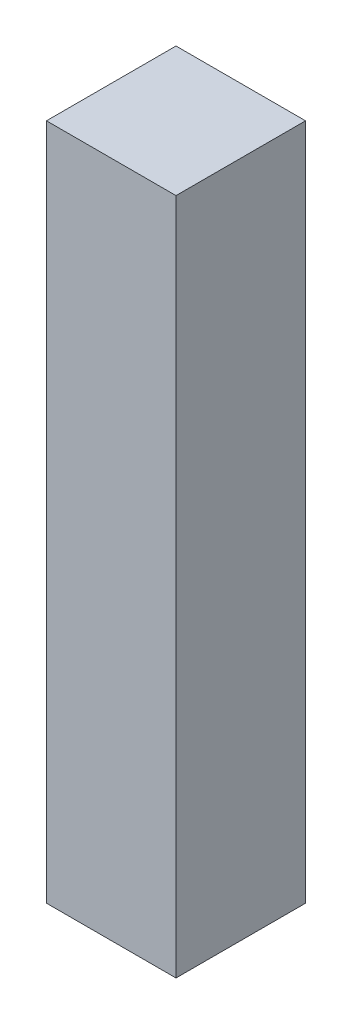
ISO-10303-21;
HEADER;
FILE_DESCRIPTION(('STEP AP214'),'2;1');
FILE_NAME('part.step','',(''),(''),'','','');
FILE_SCHEMA(('AUTOMOTIVE_DESIGN { 1 0 10303 214 1 1 1 1 }'));
ENDSEC;
DATA;
#1=APPLICATION_CONTEXT('core data for automotive mechanical design processes');
#2=APPLICATION_PROTOCOL_DEFINITION('international standard','automotive_design',2000,#1);
#3=PRODUCT_CONTEXT('',#1,'mechanical');
#4=PRODUCT('Part','Part','',(#3));
#5=PRODUCT_RELATED_PRODUCT_CATEGORY('part','',(#4));
#6=PRODUCT_DEFINITION_FORMATION('','',#4);
#7=PRODUCT_DEFINITION_CONTEXT('part definition',#1,'design');
#8=PRODUCT_DEFINITION('design','',#6,#7);
#9=PRODUCT_DEFINITION_SHAPE('','',#8);
#10=(LENGTH_UNIT() NAMED_UNIT(*) SI_UNIT(.MILLI.,.METRE.));
#11=(NAMED_UNIT(*) PLANE_ANGLE_UNIT() SI_UNIT($,.RADIAN.));
#12=(NAMED_UNIT(*) SI_UNIT($,.STERADIAN.) SOLID_ANGLE_UNIT());
#13=UNCERTAINTY_MEASURE_WITH_UNIT(LENGTH_MEASURE(1.E-05),#10,'distance_accuracy_value','');
#14=(GEOMETRIC_REPRESENTATION_CONTEXT(3) GLOBAL_UNCERTAINTY_ASSIGNED_CONTEXT((#13)) GLOBAL_UNIT_ASSIGNED_CONTEXT((#10,
#11,#12)) REPRESENTATION_CONTEXT('',''));
#15=CARTESIAN_POINT('',(0.,0.,0.));
#16=DIRECTION('',(0.,0.,1.));
#17=DIRECTION('',(1.,0.,0.));
#18=AXIS2_PLACEMENT_3D('',#15,#16,#17);
#19=CARTESIAN_POINT('',(41.275,431.8,-41.275));
#20=DIRECTION('',(-1.,0.,0.));
#21=DIRECTION('',(0.,0.,1.));
#22=AXIS2_PLACEMENT_3D('',#19,#20,#21);
#23=PLANE('',#22);
#24=DIRECTION('',(0.,0.,-1.));
#25=VECTOR('',#24,1.);
#26=CARTESIAN_POINT('',(41.275,0.,-41.275));
#27=LINE('',#26,#25);
#28=CARTESIAN_POINT('',(41.275,0.,41.275));
#29=VERTEX_POINT('',#28);
#30=CARTESIAN_POINT('',(41.275,0.,-41.275));
#31=VERTEX_POINT('',#30);
#32=EDGE_CURVE('E96',#29,#31,#27,.T.);
#33=ORIENTED_EDGE('',*,*,#32,.T.);
#34=DIRECTION('',(0.,-1.,0.));
#35=VECTOR('',#34,1.);
#36=CARTESIAN_POINT('',(41.275,431.8,-41.275));
#37=LINE('',#36,#35);
#38=CARTESIAN_POINT('',(41.275,431.8,-41.275));
#39=VERTEX_POINT('',#38);
#40=EDGE_CURVE('E11',#39,#31,#37,.T.);
#41=ORIENTED_EDGE('',*,*,#40,.F.);
#42=DIRECTION('',(0.,0.,-1.));
#43=VECTOR('',#42,1.);
#44=CARTESIAN_POINT('',(41.275,431.8,-41.275));
#45=LINE('',#44,#43);
#46=CARTESIAN_POINT('',(41.275,431.8,41.275));
#47=VERTEX_POINT('',#46);
#48=EDGE_CURVE('E84',#47,#39,#45,.T.);
#49=ORIENTED_EDGE('',*,*,#48,.F.);
#50=DIRECTION('',(0.,-1.,0.));
#51=VECTOR('',#50,1.);
#52=CARTESIAN_POINT('',(41.275,431.8,41.275));
#53=LINE('',#52,#51);
#54=EDGE_CURVE('E92',#47,#29,#53,.T.);
#55=ORIENTED_EDGE('',*,*,#54,.T.);
#56=EDGE_LOOP('',(#33,#41,#49,#55));
#57=FACE_BOUND('',#56,.T.);
#58=ADVANCED_FACE('F33',(#57),#23,.F.);
#59=CARTESIAN_POINT('',(-41.275,431.8,-41.275));
#60=DIRECTION('',(0.,0.,1.));
#61=DIRECTION('',(1.,0.,0.));
#62=AXIS2_PLACEMENT_3D('',#59,#60,#61);
#63=PLANE('',#62);
#64=DIRECTION('',(-1.,0.,0.));
#65=VECTOR('',#64,1.);
#66=CARTESIAN_POINT('',(-41.275,0.,-41.275));
#67=LINE('',#66,#65);
#68=CARTESIAN_POINT('',(-41.275,0.,-41.275));
#69=VERTEX_POINT('',#68);
#70=EDGE_CURVE('E88',#31,#69,#67,.T.);
#71=ORIENTED_EDGE('',*,*,#70,.T.);
#72=DIRECTION('',(0.,-1.,0.));
#73=VECTOR('',#72,1.);
#74=CARTESIAN_POINT('',(-41.275,431.8,-41.275));
#75=LINE('',#74,#73);
#76=CARTESIAN_POINT('',(-41.275,431.8,-41.275));
#77=VERTEX_POINT('',#76);
#78=EDGE_CURVE('E41',#77,#69,#75,.T.);
#79=ORIENTED_EDGE('',*,*,#78,.F.);
#80=DIRECTION('',(-1.,0.,0.));
#81=VECTOR('',#80,1.);
#82=CARTESIAN_POINT('',(-41.275,431.8,-41.275));
#83=LINE('',#82,#81);
#84=EDGE_CURVE('E79',#39,#77,#83,.T.);
#85=ORIENTED_EDGE('',*,*,#84,.F.);
#86=ORIENTED_EDGE('',*,*,#40,.T.);
#87=EDGE_LOOP('',(#71,#79,#85,#86));
#88=FACE_BOUND('',#87,.T.);
#89=ADVANCED_FACE('F87',(#88),#63,.F.);
#90=CARTESIAN_POINT('',(-41.275,431.8,-41.275));
#91=DIRECTION('',(1.,0.,0.));
#92=DIRECTION('',(0.,0.,-1.));
#93=AXIS2_PLACEMENT_3D('',#90,#91,#92);
#94=PLANE('',#93);
#95=DIRECTION('',(0.,0.,1.));
#96=VECTOR('',#95,1.);
#97=CARTESIAN_POINT('',(-41.275,0.,-41.275));
#98=LINE('',#97,#96);
#99=CARTESIAN_POINT('',(-41.275,0.,41.275));
#100=VERTEX_POINT('',#99);
#101=EDGE_CURVE('E66',#69,#100,#98,.T.);
#102=ORIENTED_EDGE('',*,*,#101,.T.);
#103=DIRECTION('',(0.,-1.,0.));
#104=VECTOR('',#103,1.);
#105=CARTESIAN_POINT('',(-41.275,431.8,41.275));
#106=LINE('',#105,#104);
#107=CARTESIAN_POINT('',(-41.275,431.8,41.275));
#108=VERTEX_POINT('',#107);
#109=EDGE_CURVE('E89',#108,#100,#106,.T.);
#110=ORIENTED_EDGE('',*,*,#109,.F.);
#111=DIRECTION('',(0.,0.,1.));
#112=VECTOR('',#111,1.);
#113=CARTESIAN_POINT('',(-41.275,431.8,-41.275));
#114=LINE('',#113,#112);
#115=EDGE_CURVE('E82',#77,#108,#114,.T.);
#116=ORIENTED_EDGE('',*,*,#115,.F.);
#117=ORIENTED_EDGE('',*,*,#78,.T.);
#118=EDGE_LOOP('',(#102,#110,#116,#117));
#119=FACE_BOUND('',#118,.T.);
#120=ADVANCED_FACE('F90',(#119),#94,.F.);
#121=CARTESIAN_POINT('',(-41.275,431.8,41.275));
#122=DIRECTION('',(0.,0.,-1.));
#123=DIRECTION('',(-1.,0.,0.));
#124=AXIS2_PLACEMENT_3D('',#121,#122,#123);
#125=PLANE('',#124);
#126=DIRECTION('',(1.,0.,0.));
#127=VECTOR('',#126,1.);
#128=CARTESIAN_POINT('',(-41.275,0.,41.275));
#129=LINE('',#128,#127);
#130=EDGE_CURVE('E72',#100,#29,#129,.T.);
#131=ORIENTED_EDGE('',*,*,#130,.T.);
#132=ORIENTED_EDGE('',*,*,#54,.F.);
#133=DIRECTION('',(1.,0.,0.));
#134=VECTOR('',#133,1.);
#135=CARTESIAN_POINT('',(-41.275,431.8,41.275));
#136=LINE('',#135,#134);
#137=EDGE_CURVE('E49',#108,#47,#136,.T.);
#138=ORIENTED_EDGE('',*,*,#137,.F.);
#139=ORIENTED_EDGE('',*,*,#109,.T.);
#140=EDGE_LOOP('',(#131,#132,#138,#139));
#141=FACE_BOUND('',#140,.T.);
#142=ADVANCED_FACE('F103',(#141),#125,.F.);
#143=CARTESIAN_POINT('',(0.,431.8,0.));
#144=DIRECTION('',(0.,1.,0.));
#145=DIRECTION('',(0.,0.,1.));
#146=AXIS2_PLACEMENT_3D('',#143,#144,#145);
#147=PLANE('',#146);
#148=ORIENTED_EDGE('',*,*,#48,.T.);
#149=ORIENTED_EDGE('',*,*,#84,.T.);
#150=ORIENTED_EDGE('',*,*,#115,.T.);
#151=ORIENTED_EDGE('',*,*,#137,.T.);
#152=EDGE_LOOP('',(#148,#149,#150,#151));
#153=FACE_BOUND('',#152,.T.);
#154=ADVANCED_FACE('F80',(#153),#147,.T.);
#155=CARTESIAN_POINT('',(0.,0.,0.));
#156=DIRECTION('',(0.,1.,0.));
#157=DIRECTION('',(0.,0.,1.));
#158=AXIS2_PLACEMENT_3D('',#155,#156,#157);
#159=PLANE('',#158);
#160=ORIENTED_EDGE('',*,*,#32,.F.);
#161=ORIENTED_EDGE('',*,*,#130,.F.);
#162=ORIENTED_EDGE('',*,*,#101,.F.);
#163=ORIENTED_EDGE('',*,*,#70,.F.);
#164=EDGE_LOOP('',(#160,#161,#162,#163));
#165=FACE_BOUND('',#164,.T.);
#166=ADVANCED_FACE('F106',(#165),#159,.F.);
#167=CLOSED_SHELL('',(#58,#89,#120,#142,#154,#166));
#168=MANIFOLD_SOLID_BREP('B2',#167);
#169=ADVANCED_BREP_SHAPE_REPRESENTATION('',(#18,#168),#14);
#170=SHAPE_DEFINITION_REPRESENTATION(#9,#169);
ENDSEC;
END-ISO-10303-21;
